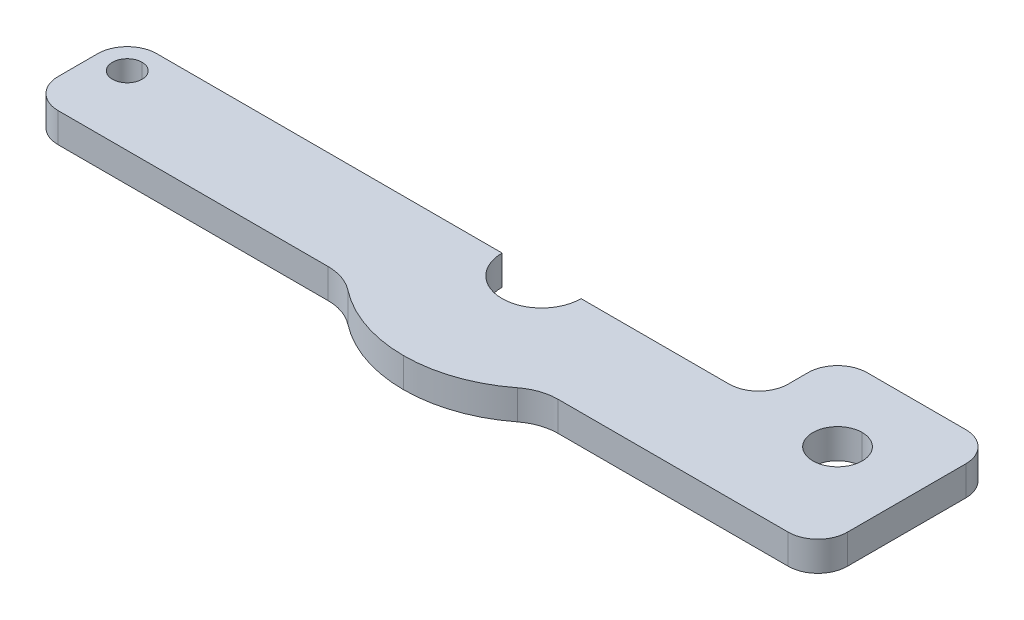
ISO-10303-21;
HEADER;
FILE_DESCRIPTION(('STEP AP214'),'2;1');
FILE_NAME('part.step','',(''),(''),'','','');
FILE_SCHEMA(('AUTOMOTIVE_DESIGN { 1 0 10303 214 1 1 1 1 }'));
ENDSEC;
DATA;
#1=APPLICATION_CONTEXT('core data for automotive mechanical design processes');
#2=APPLICATION_PROTOCOL_DEFINITION('international standard','automotive_design',2000,#1);
#3=PRODUCT_CONTEXT('',#1,'mechanical');
#4=PRODUCT('Part','Part','',(#3));
#5=PRODUCT_RELATED_PRODUCT_CATEGORY('part','',(#4));
#6=PRODUCT_DEFINITION_FORMATION('','',#4);
#7=PRODUCT_DEFINITION_CONTEXT('part definition',#1,'design');
#8=PRODUCT_DEFINITION('design','',#6,#7);
#9=PRODUCT_DEFINITION_SHAPE('','',#8);
#10=(LENGTH_UNIT() NAMED_UNIT(*) SI_UNIT(.MILLI.,.METRE.));
#11=(NAMED_UNIT(*) PLANE_ANGLE_UNIT() SI_UNIT($,.RADIAN.));
#12=(NAMED_UNIT(*) SI_UNIT($,.STERADIAN.) SOLID_ANGLE_UNIT());
#13=UNCERTAINTY_MEASURE_WITH_UNIT(LENGTH_MEASURE(1.E-05),#10,'distance_accuracy_value','');
#14=(GEOMETRIC_REPRESENTATION_CONTEXT(3) GLOBAL_UNCERTAINTY_ASSIGNED_CONTEXT((#13)) GLOBAL_UNIT_ASSIGNED_CONTEXT((#10,
#11,#12)) REPRESENTATION_CONTEXT('',''));
#15=CARTESIAN_POINT('',(0.,0.,0.));
#16=DIRECTION('',(0.,0.,1.));
#17=DIRECTION('',(1.,0.,0.));
#18=AXIS2_PLACEMENT_3D('',#15,#16,#17);
#19=CARTESIAN_POINT('',(11.6619037896906,-20.,15.));
#20=DIRECTION('',(0.,1.,0.));
#21=DIRECTION('',(0.,0.,1.));
#22=AXIS2_PLACEMENT_3D('',#19,#20,#21);
#23=CYLINDRICAL_SURFACE('',#22,5.);
#24=CARTESIAN_POINT('',(11.6619037896906,0.,15.));
#25=DIRECTION('',(0.,1.,0.));
#26=DIRECTION('',(0.,0.,1.));
#27=AXIS2_PLACEMENT_3D('',#24,#25,#26);
#28=CIRCLE('',#27,5.);
#29=CARTESIAN_POINT('',(11.6619037896906,0.,10.));
#30=VERTEX_POINT('',#29);
#31=CARTESIAN_POINT('',(8.59298173977202,0.,11.0526315789474));
#32=VERTEX_POINT('',#31);
#33=EDGE_CURVE('E237',#30,#32,#28,.T.);
#34=ORIENTED_EDGE('',*,*,#33,.F.);
#35=DIRECTION('',(0.,-1.,0.));
#36=VECTOR('',#35,1.);
#37=CARTESIAN_POINT('',(11.6619037896906,3.,10.));
#38=LINE('',#37,#36);
#39=CARTESIAN_POINT('',(11.6619037896906,3.,10.));
#40=VERTEX_POINT('',#39);
#41=EDGE_CURVE('E51',#40,#30,#38,.T.);
#42=ORIENTED_EDGE('',*,*,#41,.F.);
#43=CARTESIAN_POINT('',(11.6619037896906,3.,15.));
#44=DIRECTION('',(0.,-1.,0.));
#45=DIRECTION('',(0.,0.,1.));
#46=AXIS2_PLACEMENT_3D('',#43,#44,#45);
#47=CIRCLE('',#46,5.);
#48=CARTESIAN_POINT('',(8.59298173977202,3.,11.0526315789474));
#49=VERTEX_POINT('',#48);
#50=EDGE_CURVE('E458',#49,#40,#47,.T.);
#51=ORIENTED_EDGE('',*,*,#50,.F.);
#52=DIRECTION('',(0.,1.,0.));
#53=VECTOR('',#52,1.);
#54=CARTESIAN_POINT('',(8.59298173977202,-20.,11.0526315789474));
#55=LINE('',#54,#53);
#56=EDGE_CURVE('E11',#32,#49,#55,.T.);
#57=ORIENTED_EDGE('',*,*,#56,.F.);
#58=EDGE_LOOP('',(#34,#42,#51,#57));
#59=FACE_BOUND('',#58,.T.);
#60=ADVANCED_FACE('F17',(#59),#23,.F.);
#61=CARTESIAN_POINT('',(-11.6619037896906,-20.,15.));
#62=DIRECTION('',(0.,1.,0.));
#63=DIRECTION('',(0.,0.,1.));
#64=AXIS2_PLACEMENT_3D('',#61,#62,#63);
#65=CYLINDRICAL_SURFACE('',#64,5.);
#66=CARTESIAN_POINT('',(-11.6619037896906,0.,15.));
#67=DIRECTION('',(0.,1.,0.));
#68=DIRECTION('',(0.,0.,1.));
#69=AXIS2_PLACEMENT_3D('',#66,#67,#68);
#70=CIRCLE('',#69,5.);
#71=CARTESIAN_POINT('',(-8.59298173977202,0.,11.0526315789474));
#72=VERTEX_POINT('',#71);
#73=CARTESIAN_POINT('',(-11.6619037896906,0.,10.));
#74=VERTEX_POINT('',#73);
#75=EDGE_CURVE('E246',#72,#74,#70,.T.);
#76=ORIENTED_EDGE('',*,*,#75,.F.);
#77=DIRECTION('',(0.,-1.,0.));
#78=VECTOR('',#77,1.);
#79=CARTESIAN_POINT('',(-8.59298173977202,-20.,11.0526315789474));
#80=LINE('',#79,#78);
#81=CARTESIAN_POINT('',(-8.59298173977202,3.,11.0526315789474));
#82=VERTEX_POINT('',#81);
#83=EDGE_CURVE('E405',#82,#72,#80,.T.);
#84=ORIENTED_EDGE('',*,*,#83,.F.);
#85=CARTESIAN_POINT('',(-11.6619037896906,3.,15.));
#86=DIRECTION('',(0.,-1.,0.));
#87=DIRECTION('',(0.,0.,1.));
#88=AXIS2_PLACEMENT_3D('',#85,#86,#87);
#89=CIRCLE('',#88,5.);
#90=CARTESIAN_POINT('',(-11.6619037896906,3.,10.));
#91=VERTEX_POINT('',#90);
#92=EDGE_CURVE('E450',#91,#82,#89,.T.);
#93=ORIENTED_EDGE('',*,*,#92,.F.);
#94=DIRECTION('',(0.,1.,0.));
#95=VECTOR('',#94,1.);
#96=CARTESIAN_POINT('',(-11.6619037896906,3.,10.));
#97=LINE('',#96,#95);
#98=EDGE_CURVE('E414',#74,#91,#97,.T.);
#99=ORIENTED_EDGE('',*,*,#98,.F.);
#100=EDGE_LOOP('',(#76,#84,#93,#99));
#101=FACE_BOUND('',#100,.T.);
#102=ADVANCED_FACE('F573',(#101),#65,.F.);
#103=CARTESIAN_POINT('',(0.,-20.,0.));
#104=DIRECTION('',(0.,1.,0.));
#105=DIRECTION('',(0.,0.,1.));
#106=AXIS2_PLACEMENT_3D('',#103,#104,#105);
#107=CYLINDRICAL_SURFACE('',#106,14.);
#108=DIRECTION('',(0.,1.,0.));
#109=VECTOR('',#108,1.);
#110=CARTESIAN_POINT('',(0.,-20.,14.));
#111=LINE('',#110,#109);
#112=CARTESIAN_POINT('',(0.,0.,14.));
#113=VERTEX_POINT('',#112);
#114=CARTESIAN_POINT('',(0.,3.,14.));
#115=VERTEX_POINT('',#114);
#116=EDGE_CURVE('E390',#113,#115,#111,.T.);
#117=ORIENTED_EDGE('',*,*,#116,.F.);
#118=CARTESIAN_POINT('',(0.,0.,0.));
#119=DIRECTION('',(0.,-1.,0.));
#120=DIRECTION('',(0.,0.,1.));
#121=AXIS2_PLACEMENT_3D('',#118,#119,#120);
#122=CIRCLE('',#121,14.);
#123=EDGE_CURVE('E241',#32,#113,#122,.T.);
#124=ORIENTED_EDGE('',*,*,#123,.F.);
#125=ORIENTED_EDGE('',*,*,#56,.T.);
#126=CARTESIAN_POINT('',(0.,3.,0.));
#127=DIRECTION('',(0.,1.,0.));
#128=DIRECTION('',(0.,0.,1.));
#129=AXIS2_PLACEMENT_3D('',#126,#127,#128);
#130=CIRCLE('',#129,14.);
#131=EDGE_CURVE('E454',#115,#49,#130,.T.);
#132=ORIENTED_EDGE('',*,*,#131,.F.);
#133=EDGE_LOOP('',(#117,#124,#125,#132));
#134=FACE_BOUND('',#133,.T.);
#135=ADVANCED_FACE('F577',(#134),#107,.T.);
#136=CARTESIAN_POINT('',(-39.,-0.00100000000000013,3.));
#137=DIRECTION('',(0.,1.,0.));
#138=DIRECTION('',(0.,0.,1.));
#139=AXIS2_PLACEMENT_3D('',#136,#137,#138);
#140=CYLINDRICAL_SURFACE('',#139,1.5);
#141=DIRECTION('',(0.,1.,0.));
#142=VECTOR('',#141,1.);
#143=CARTESIAN_POINT('',(-39.,-0.00100000000000013,1.5));
#144=LINE('',#143,#142);
#145=CARTESIAN_POINT('',(-39.,0.,1.5));
#146=VERTEX_POINT('',#145);
#147=CARTESIAN_POINT('',(-39.,3.,1.5));
#148=VERTEX_POINT('',#147);
#149=EDGE_CURVE('E418',#146,#148,#144,.T.);
#150=ORIENTED_EDGE('',*,*,#149,.F.);
#151=CARTESIAN_POINT('',(-39.,0.,3.));
#152=DIRECTION('',(0.,-1.,0.));
#153=DIRECTION('',(0.,0.,1.));
#154=AXIS2_PLACEMENT_3D('',#151,#152,#153);
#155=CIRCLE('',#154,1.5);
#156=CARTESIAN_POINT('',(-39.,0.,4.5));
#157=VERTEX_POINT('',#156);
#158=EDGE_CURVE('E242',#146,#157,#155,.T.);
#159=ORIENTED_EDGE('',*,*,#158,.T.);
#160=DIRECTION('',(0.,1.,0.));
#161=VECTOR('',#160,1.);
#162=CARTESIAN_POINT('',(-39.,-0.00100000000000013,4.5));
#163=LINE('',#162,#161);
#164=CARTESIAN_POINT('',(-39.,3.,4.5));
#165=VERTEX_POINT('',#164);
#166=EDGE_CURVE('E423',#157,#165,#163,.T.);
#167=ORIENTED_EDGE('',*,*,#166,.T.);
#168=CARTESIAN_POINT('',(-39.,3.,3.));
#169=DIRECTION('',(0.,1.,0.));
#170=DIRECTION('',(0.,0.,1.));
#171=AXIS2_PLACEMENT_3D('',#168,#169,#170);
#172=CIRCLE('',#171,1.5);
#173=EDGE_CURVE('E325',#165,#148,#172,.T.);
#174=ORIENTED_EDGE('',*,*,#173,.T.);
#175=EDGE_LOOP('',(#150,#159,#167,#174));
#176=FACE_BOUND('',#175,.T.);
#177=ADVANCED_FACE('F555',(#176),#140,.F.);
#178=CARTESIAN_POINT('',(-39.,3.,3.));
#179=DIRECTION('',(0.,-1.,0.));
#180=DIRECTION('',(0.,0.,-1.));
#181=AXIS2_PLACEMENT_3D('',#178,#179,#180);
#182=CYLINDRICAL_SURFACE('',#181,3.);
#183=CARTESIAN_POINT('',(-39.,3.,3.));
#184=DIRECTION('',(0.,1.,0.));
#185=DIRECTION('',(0.,0.,1.));
#186=AXIS2_PLACEMENT_3D('',#183,#184,#185);
#187=CIRCLE('',#186,3.);
#188=CARTESIAN_POINT('',(-39.,3.,0.));
#189=VERTEX_POINT('',#188);
#190=CARTESIAN_POINT('',(-42.,3.,3.));
#191=VERTEX_POINT('',#190);
#192=EDGE_CURVE('E324',#189,#191,#187,.T.);
#193=ORIENTED_EDGE('',*,*,#192,.F.);
#194=DIRECTION('',(0.,1.,0.));
#195=VECTOR('',#194,1.);
#196=CARTESIAN_POINT('',(-39.,3.,0.));
#197=LINE('',#196,#195);
#198=CARTESIAN_POINT('',(-39.,0.,0.));
#199=VERTEX_POINT('',#198);
#200=EDGE_CURVE('E234',#199,#189,#197,.T.);
#201=ORIENTED_EDGE('',*,*,#200,.F.);
#202=CARTESIAN_POINT('',(-39.,0.,3.));
#203=DIRECTION('',(0.,-1.,0.));
#204=DIRECTION('',(0.,0.,1.));
#205=AXIS2_PLACEMENT_3D('',#202,#203,#204);
#206=CIRCLE('',#205,3.);
#207=CARTESIAN_POINT('',(-42.,0.,3.));
#208=VERTEX_POINT('',#207);
#209=EDGE_CURVE('E337',#208,#199,#206,.T.);
#210=ORIENTED_EDGE('',*,*,#209,.F.);
#211=DIRECTION('',(0.,-1.,0.));
#212=VECTOR('',#211,1.);
#213=CARTESIAN_POINT('',(-42.,3.,3.));
#214=LINE('',#213,#212);
#215=EDGE_CURVE('E233',#191,#208,#214,.T.);
#216=ORIENTED_EDGE('',*,*,#215,.F.);
#217=EDGE_LOOP('',(#193,#201,#210,#216));
#218=FACE_BOUND('',#217,.T.);
#219=ADVANCED_FACE('F378',(#218),#182,.T.);
#220=CARTESIAN_POINT('',(-39.,3.,7.));
#221=DIRECTION('',(0.,-1.,0.));
#222=DIRECTION('',(0.,0.,-1.));
#223=AXIS2_PLACEMENT_3D('',#220,#221,#222);
#224=CYLINDRICAL_SURFACE('',#223,3.);
#225=CARTESIAN_POINT('',(-39.,3.,7.));
#226=DIRECTION('',(0.,1.,0.));
#227=DIRECTION('',(0.,0.,1.));
#228=AXIS2_PLACEMENT_3D('',#225,#226,#227);
#229=CIRCLE('',#228,3.);
#230=CARTESIAN_POINT('',(-42.,3.,7.));
#231=VERTEX_POINT('',#230);
#232=CARTESIAN_POINT('',(-39.,3.,10.));
#233=VERTEX_POINT('',#232);
#234=EDGE_CURVE('E446',#231,#233,#229,.T.);
#235=ORIENTED_EDGE('',*,*,#234,.F.);
#236=DIRECTION('',(0.,1.,0.));
#237=VECTOR('',#236,1.);
#238=CARTESIAN_POINT('',(-42.,3.,7.));
#239=LINE('',#238,#237);
#240=CARTESIAN_POINT('',(-42.,0.,7.));
#241=VERTEX_POINT('',#240);
#242=EDGE_CURVE('E230',#241,#231,#239,.T.);
#243=ORIENTED_EDGE('',*,*,#242,.F.);
#244=CARTESIAN_POINT('',(-39.,0.,7.));
#245=DIRECTION('',(0.,-1.,0.));
#246=DIRECTION('',(0.,0.,1.));
#247=AXIS2_PLACEMENT_3D('',#244,#245,#246);
#248=CIRCLE('',#247,3.);
#249=CARTESIAN_POINT('',(-39.,0.,10.));
#250=VERTEX_POINT('',#249);
#251=EDGE_CURVE('E332',#250,#241,#248,.T.);
#252=ORIENTED_EDGE('',*,*,#251,.F.);
#253=DIRECTION('',(0.,-1.,0.));
#254=VECTOR('',#253,1.);
#255=CARTESIAN_POINT('',(-39.,3.,10.));
#256=LINE('',#255,#254);
#257=EDGE_CURVE('E440',#233,#250,#256,.T.);
#258=ORIENTED_EDGE('',*,*,#257,.F.);
#259=EDGE_LOOP('',(#235,#243,#252,#258));
#260=FACE_BOUND('',#259,.T.);
#261=ADVANCED_FACE('F980',(#260),#224,.T.);
#262=CARTESIAN_POINT('',(19.,3.,-3.));
#263=DIRECTION('',(0.,1.,0.));
#264=DIRECTION('',(0.,0.,1.));
#265=AXIS2_PLACEMENT_3D('',#262,#263,#264);
#266=CYLINDRICAL_SURFACE('',#265,3.);
#267=CARTESIAN_POINT('',(19.,3.,-3.));
#268=DIRECTION('',(0.,-1.,0.));
#269=DIRECTION('',(0.,0.,1.));
#270=AXIS2_PLACEMENT_3D('',#267,#268,#269);
#271=CIRCLE('',#270,3.);
#272=CARTESIAN_POINT('',(22.,3.,-3.));
#273=VERTEX_POINT('',#272);
#274=CARTESIAN_POINT('',(19.,3.,0.));
#275=VERTEX_POINT('',#274);
#276=EDGE_CURVE('E308',#273,#275,#271,.T.);
#277=ORIENTED_EDGE('',*,*,#276,.F.);
#278=DIRECTION('',(0.,1.,0.));
#279=VECTOR('',#278,1.);
#280=CARTESIAN_POINT('',(22.,3.,-3.));
#281=LINE('',#280,#279);
#282=CARTESIAN_POINT('',(22.,0.,-3.));
#283=VERTEX_POINT('',#282);
#284=EDGE_CURVE('E250',#283,#273,#281,.T.);
#285=ORIENTED_EDGE('',*,*,#284,.F.);
#286=CARTESIAN_POINT('',(19.,0.,-3.));
#287=DIRECTION('',(0.,1.,0.));
#288=DIRECTION('',(0.,0.,1.));
#289=AXIS2_PLACEMENT_3D('',#286,#287,#288);
#290=CIRCLE('',#289,3.);
#291=CARTESIAN_POINT('',(19.,0.,0.));
#292=VERTEX_POINT('',#291);
#293=EDGE_CURVE('E353',#292,#283,#290,.T.);
#294=ORIENTED_EDGE('',*,*,#293,.F.);
#295=DIRECTION('',(0.,-1.,0.));
#296=VECTOR('',#295,1.);
#297=CARTESIAN_POINT('',(19.,0.,0.));
#298=LINE('',#297,#296);
#299=EDGE_CURVE('E253',#275,#292,#298,.T.);
#300=ORIENTED_EDGE('',*,*,#299,.F.);
#301=EDGE_LOOP('',(#277,#285,#294,#300));
#302=FACE_BOUND('',#301,.T.);
#303=ADVANCED_FACE('F488',(#302),#266,.F.);
#304=CARTESIAN_POINT('',(25.,3.,-5.));
#305=DIRECTION('',(0.,-1.,0.));
#306=DIRECTION('',(0.,0.,-1.));
#307=AXIS2_PLACEMENT_3D('',#304,#305,#306);
#308=CYLINDRICAL_SURFACE('',#307,3.);
#309=CARTESIAN_POINT('',(25.,3.,-5.));
#310=DIRECTION('',(0.,1.,0.));
#311=DIRECTION('',(0.,0.,1.));
#312=AXIS2_PLACEMENT_3D('',#309,#310,#311);
#313=CIRCLE('',#312,3.);
#314=CARTESIAN_POINT('',(25.,3.,-8.));
#315=VERTEX_POINT('',#314);
#316=CARTESIAN_POINT('',(22.,3.,-5.));
#317=VERTEX_POINT('',#316);
#318=EDGE_CURVE('E283',#315,#317,#313,.T.);
#319=ORIENTED_EDGE('',*,*,#318,.F.);
#320=DIRECTION('',(0.,1.,0.));
#321=VECTOR('',#320,1.);
#322=CARTESIAN_POINT('',(25.,3.,-8.));
#323=LINE('',#322,#321);
#324=CARTESIAN_POINT('',(25.,0.,-8.));
#325=VERTEX_POINT('',#324);
#326=EDGE_CURVE('E20',#325,#315,#323,.T.);
#327=ORIENTED_EDGE('',*,*,#326,.F.);
#328=CARTESIAN_POINT('',(25.,0.,-5.));
#329=DIRECTION('',(0.,-1.,0.));
#330=DIRECTION('',(0.,0.,1.));
#331=AXIS2_PLACEMENT_3D('',#328,#329,#330);
#332=CIRCLE('',#331,3.);
#333=CARTESIAN_POINT('',(22.,0.,-5.));
#334=VERTEX_POINT('',#333);
#335=EDGE_CURVE('E362',#334,#325,#332,.T.);
#336=ORIENTED_EDGE('',*,*,#335,.F.);
#337=DIRECTION('',(0.,-1.,0.));
#338=VECTOR('',#337,1.);
#339=CARTESIAN_POINT('',(22.,3.,-5.));
#340=LINE('',#339,#338);
#341=EDGE_CURVE('E247',#317,#334,#340,.T.);
#342=ORIENTED_EDGE('',*,*,#341,.F.);
#343=EDGE_LOOP('',(#319,#327,#336,#342));
#344=FACE_BOUND('',#343,.T.);
#345=ADVANCED_FACE('F284',(#344),#308,.T.);
#346=CARTESIAN_POINT('',(35.,3.,-5.));
#347=DIRECTION('',(0.,-1.,0.));
#348=DIRECTION('',(0.,0.,-1.));
#349=AXIS2_PLACEMENT_3D('',#346,#347,#348);
#350=CYLINDRICAL_SURFACE('',#349,3.);
#351=CARTESIAN_POINT('',(35.,3.,-5.));
#352=DIRECTION('',(0.,1.,0.));
#353=DIRECTION('',(0.,0.,1.));
#354=AXIS2_PLACEMENT_3D('',#351,#352,#353);
#355=CIRCLE('',#354,3.);
#356=CARTESIAN_POINT('',(38.,3.,-5.));
#357=VERTEX_POINT('',#356);
#358=CARTESIAN_POINT('',(35.,3.,-8.));
#359=VERTEX_POINT('',#358);
#360=EDGE_CURVE('E294',#357,#359,#355,.T.);
#361=ORIENTED_EDGE('',*,*,#360,.F.);
#362=DIRECTION('',(0.,1.,0.));
#363=VECTOR('',#362,1.);
#364=CARTESIAN_POINT('',(38.,3.,-5.));
#365=LINE('',#364,#363);
#366=CARTESIAN_POINT('',(38.,0.,-5.));
#367=VERTEX_POINT('',#366);
#368=EDGE_CURVE('E202',#367,#357,#365,.T.);
#369=ORIENTED_EDGE('',*,*,#368,.F.);
#370=CARTESIAN_POINT('',(35.,0.,-5.));
#371=DIRECTION('',(0.,-1.,0.));
#372=DIRECTION('',(0.,0.,1.));
#373=AXIS2_PLACEMENT_3D('',#370,#371,#372);
#374=CIRCLE('',#373,3.);
#375=CARTESIAN_POINT('',(35.,0.,-8.));
#376=VERTEX_POINT('',#375);
#377=EDGE_CURVE('E217',#376,#367,#374,.T.);
#378=ORIENTED_EDGE('',*,*,#377,.F.);
#379=DIRECTION('',(0.,-1.,0.));
#380=VECTOR('',#379,1.);
#381=CARTESIAN_POINT('',(35.,3.,-8.));
#382=LINE('',#381,#380);
#383=EDGE_CURVE('E263',#359,#376,#382,.T.);
#384=ORIENTED_EDGE('',*,*,#383,.F.);
#385=EDGE_LOOP('',(#361,#369,#378,#384));
#386=FACE_BOUND('',#385,.T.);
#387=ADVANCED_FACE('F951',(#386),#350,.T.);
#388=CARTESIAN_POINT('',(35.,3.,7.));
#389=DIRECTION('',(0.,-1.,0.));
#390=DIRECTION('',(0.,0.,-1.));
#391=AXIS2_PLACEMENT_3D('',#388,#389,#390);
#392=CYLINDRICAL_SURFACE('',#391,3.);
#393=CARTESIAN_POINT('',(35.,3.,7.));
#394=DIRECTION('',(0.,1.,0.));
#395=DIRECTION('',(0.,0.,1.));
#396=AXIS2_PLACEMENT_3D('',#393,#394,#395);
#397=CIRCLE('',#396,3.);
#398=CARTESIAN_POINT('',(35.,3.,10.));
#399=VERTEX_POINT('',#398);
#400=CARTESIAN_POINT('',(38.,3.,7.));
#401=VERTEX_POINT('',#400);
#402=EDGE_CURVE('E466',#399,#401,#397,.T.);
#403=ORIENTED_EDGE('',*,*,#402,.F.);
#404=DIRECTION('',(0.,1.,0.));
#405=VECTOR('',#404,1.);
#406=CARTESIAN_POINT('',(35.,3.,10.));
#407=LINE('',#406,#405);
#408=CARTESIAN_POINT('',(35.,0.,10.));
#409=VERTEX_POINT('',#408);
#410=EDGE_CURVE('E203',#409,#399,#407,.T.);
#411=ORIENTED_EDGE('',*,*,#410,.F.);
#412=CARTESIAN_POINT('',(35.,0.,7.));
#413=DIRECTION('',(0.,-1.,0.));
#414=DIRECTION('',(0.,0.,1.));
#415=AXIS2_PLACEMENT_3D('',#412,#413,#414);
#416=CIRCLE('',#415,3.);
#417=CARTESIAN_POINT('',(38.,0.,7.));
#418=VERTEX_POINT('',#417);
#419=EDGE_CURVE('E206',#418,#409,#416,.T.);
#420=ORIENTED_EDGE('',*,*,#419,.F.);
#421=DIRECTION('',(0.,-1.,0.));
#422=VECTOR('',#421,1.);
#423=CARTESIAN_POINT('',(38.,3.,7.));
#424=LINE('',#423,#422);
#425=EDGE_CURVE('E190',#401,#418,#424,.T.);
#426=ORIENTED_EDGE('',*,*,#425,.F.);
#427=EDGE_LOOP('',(#403,#411,#420,#426));
#428=FACE_BOUND('',#427,.T.);
#429=ADVANCED_FACE('F207',(#428),#392,.T.);
#430=CARTESIAN_POINT('',(30.,3.,0.));
#431=DIRECTION('',(0.,-1.,0.));
#432=DIRECTION('',(0.,0.,-1.));
#433=AXIS2_PLACEMENT_3D('',#430,#431,#432);
#434=CYLINDRICAL_SURFACE('',#433,2.5);
#435=DIRECTION('',(0.,-1.,0.));
#436=VECTOR('',#435,1.);
#437=CARTESIAN_POINT('',(30.,3.,2.5));
#438=LINE('',#437,#436);
#439=CARTESIAN_POINT('',(30.,3.,2.5));
#440=VERTEX_POINT('',#439);
#441=CARTESIAN_POINT('',(30.,0.,2.5));
#442=VERTEX_POINT('',#441);
#443=EDGE_CURVE('E401',#440,#442,#438,.T.);
#444=ORIENTED_EDGE('',*,*,#443,.F.);
#445=CARTESIAN_POINT('',(30.,3.,0.));
#446=DIRECTION('',(0.,1.,0.));
#447=DIRECTION('',(0.,0.,1.));
#448=AXIS2_PLACEMENT_3D('',#445,#446,#447);
#449=CIRCLE('',#448,2.5);
#450=CARTESIAN_POINT('',(30.,3.,-2.5));
#451=VERTEX_POINT('',#450);
#452=EDGE_CURVE('E329',#440,#451,#449,.T.);
#453=ORIENTED_EDGE('',*,*,#452,.T.);
#454=DIRECTION('',(0.,-1.,0.));
#455=VECTOR('',#454,1.);
#456=CARTESIAN_POINT('',(30.,3.,-2.5));
#457=LINE('',#456,#455);
#458=CARTESIAN_POINT('',(30.,0.,-2.5));
#459=VERTEX_POINT('',#458);
#460=EDGE_CURVE('E400',#451,#459,#457,.T.);
#461=ORIENTED_EDGE('',*,*,#460,.T.);
#462=CARTESIAN_POINT('',(30.,0.,0.));
#463=DIRECTION('',(0.,1.,0.));
#464=DIRECTION('',(0.,0.,1.));
#465=AXIS2_PLACEMENT_3D('',#462,#463,#464);
#466=CIRCLE('',#465,2.5);
#467=EDGE_CURVE('E228',#442,#459,#466,.T.);
#468=ORIENTED_EDGE('',*,*,#467,.F.);
#469=EDGE_LOOP('',(#444,#453,#461,#468));
#470=FACE_BOUND('',#469,.T.);
#471=ADVANCED_FACE('F844',(#470),#434,.F.);
#472=CARTESIAN_POINT('',(38.,3.,-8.));
#473=DIRECTION('',(0.,0.,1.));
#474=DIRECTION('',(1.,0.,0.));
#475=AXIS2_PLACEMENT_3D('',#472,#473,#474);
#476=PLANE('',#475);
#477=DIRECTION('',(-1.,0.,0.));
#478=VECTOR('',#477,1.);
#479=CARTESIAN_POINT('',(38.,3.,-8.));
#480=LINE('',#479,#478);
#481=EDGE_CURVE('E277',#359,#315,#480,.T.);
#482=ORIENTED_EDGE('',*,*,#481,.F.);
#483=ORIENTED_EDGE('',*,*,#383,.T.);
#484=DIRECTION('',(-1.,0.,0.));
#485=VECTOR('',#484,1.);
#486=CARTESIAN_POINT('',(38.,0.,-8.));
#487=LINE('',#486,#485);
#488=EDGE_CURVE('E224',#376,#325,#487,.T.);
#489=ORIENTED_EDGE('',*,*,#488,.T.);
#490=ORIENTED_EDGE('',*,*,#326,.T.);
#491=EDGE_LOOP('',(#482,#483,#489,#490));
#492=FACE_BOUND('',#491,.T.);
#493=ADVANCED_FACE('F275',(#492),#476,.F.);
#494=CARTESIAN_POINT('',(38.,3.,10.));
#495=DIRECTION('',(-1.,0.,0.));
#496=DIRECTION('',(0.,0.,1.));
#497=AXIS2_PLACEMENT_3D('',#494,#495,#496);
#498=PLANE('',#497);
#499=DIRECTION('',(0.,0.,-1.));
#500=VECTOR('',#499,1.);
#501=CARTESIAN_POINT('',(38.,3.,10.));
#502=LINE('',#501,#500);
#503=EDGE_CURVE('E197',#401,#357,#502,.T.);
#504=ORIENTED_EDGE('',*,*,#503,.F.);
#505=ORIENTED_EDGE('',*,*,#425,.T.);
#506=DIRECTION('',(0.,0.,-1.));
#507=VECTOR('',#506,1.);
#508=CARTESIAN_POINT('',(38.,0.,10.));
#509=LINE('',#508,#507);
#510=EDGE_CURVE('E194',#418,#367,#509,.T.);
#511=ORIENTED_EDGE('',*,*,#510,.T.);
#512=ORIENTED_EDGE('',*,*,#368,.T.);
#513=EDGE_LOOP('',(#504,#505,#511,#512));
#514=FACE_BOUND('',#513,.T.);
#515=ADVANCED_FACE('F192',(#514),#498,.F.);
#516=CARTESIAN_POINT('',(-42.,3.,10.));
#517=DIRECTION('',(0.,0.,-1.));
#518=DIRECTION('',(0.,-1.,0.));
#519=AXIS2_PLACEMENT_3D('',#516,#517,#518);
#520=PLANE('',#519);
#521=DIRECTION('',(1.,0.,0.));
#522=VECTOR('',#521,1.);
#523=CARTESIAN_POINT('',(-42.,3.,10.));
#524=LINE('',#523,#522);
#525=EDGE_CURVE('E462',#40,#399,#524,.T.);
#526=ORIENTED_EDGE('',*,*,#525,.F.);
#527=ORIENTED_EDGE('',*,*,#41,.T.);
#528=DIRECTION('',(1.,0.,0.));
#529=VECTOR('',#528,1.);
#530=CARTESIAN_POINT('',(-42.,0.,10.));
#531=LINE('',#530,#529);
#532=EDGE_CURVE('E211',#30,#409,#531,.T.);
#533=ORIENTED_EDGE('',*,*,#532,.T.);
#534=ORIENTED_EDGE('',*,*,#410,.T.);
#535=EDGE_LOOP('',(#526,#527,#533,#534));
#536=FACE_BOUND('',#535,.T.);
#537=ADVANCED_FACE('F579',(#536),#520,.F.);
#538=CARTESIAN_POINT('',(-42.,3.,0.));
#539=DIRECTION('',(1.,0.,0.));
#540=DIRECTION('',(0.,1.,0.));
#541=AXIS2_PLACEMENT_3D('',#538,#539,#540);
#542=PLANE('',#541);
#543=DIRECTION('',(0.,0.,1.));
#544=VECTOR('',#543,1.);
#545=CARTESIAN_POINT('',(-42.,0.,0.));
#546=LINE('',#545,#544);
#547=EDGE_CURVE('E336',#208,#241,#546,.T.);
#548=ORIENTED_EDGE('',*,*,#547,.T.);
#549=ORIENTED_EDGE('',*,*,#242,.T.);
#550=DIRECTION('',(0.,0.,1.));
#551=VECTOR('',#550,1.);
#552=CARTESIAN_POINT('',(-42.,3.,0.));
#553=LINE('',#552,#551);
#554=EDGE_CURVE('E374',#191,#231,#553,.T.);
#555=ORIENTED_EDGE('',*,*,#554,.F.);
#556=ORIENTED_EDGE('',*,*,#215,.T.);
#557=EDGE_LOOP('',(#548,#549,#555,#556));
#558=FACE_BOUND('',#557,.T.);
#559=ADVANCED_FACE('F372',(#558),#542,.F.);
#560=CARTESIAN_POINT('',(-4.,3.,0.));
#561=DIRECTION('',(0.,0.,1.));
#562=DIRECTION('',(1.,0.,0.));
#563=AXIS2_PLACEMENT_3D('',#560,#561,#562);
#564=PLANE('',#563);
#565=DIRECTION('',(-1.,0.,0.));
#566=VECTOR('',#565,1.);
#567=CARTESIAN_POINT('',(-4.,0.,0.));
#568=LINE('',#567,#566);
#569=CARTESIAN_POINT('',(-4.,0.,0.));
#570=VERTEX_POINT('',#569);
#571=EDGE_CURVE('E341',#570,#199,#568,.T.);
#572=ORIENTED_EDGE('',*,*,#571,.T.);
#573=ORIENTED_EDGE('',*,*,#200,.T.);
#574=DIRECTION('',(-1.,0.,0.));
#575=VECTOR('',#574,1.);
#576=CARTESIAN_POINT('',(-4.,3.,0.));
#577=LINE('',#576,#575);
#578=CARTESIAN_POINT('',(-4.,3.,0.));
#579=VERTEX_POINT('',#578);
#580=EDGE_CURVE('E320',#579,#189,#577,.T.);
#581=ORIENTED_EDGE('',*,*,#580,.F.);
#582=DIRECTION('',(0.,-1.,0.));
#583=VECTOR('',#582,1.);
#584=CARTESIAN_POINT('',(-4.,3.,0.));
#585=LINE('',#584,#583);
#586=EDGE_CURVE('E259',#579,#570,#585,.T.);
#587=ORIENTED_EDGE('',*,*,#586,.T.);
#588=EDGE_LOOP('',(#572,#573,#581,#587));
#589=FACE_BOUND('',#588,.T.);
#590=ADVANCED_FACE('F475',(#589),#564,.F.);
#591=CARTESIAN_POINT('',(0.,3.,0.));
#592=DIRECTION('',(0.,-1.,0.));
#593=DIRECTION('',(0.,0.,-1.));
#594=AXIS2_PLACEMENT_3D('',#591,#592,#593);
#595=CYLINDRICAL_SURFACE('',#594,4.);
#596=CARTESIAN_POINT('',(0.,0.,0.));
#597=DIRECTION('',(0.,-1.,0.));
#598=DIRECTION('',(0.,0.,1.));
#599=AXIS2_PLACEMENT_3D('',#596,#597,#598);
#600=CIRCLE('',#599,4.);
#601=CARTESIAN_POINT('',(4.,0.,0.));
#602=VERTEX_POINT('',#601);
#603=EDGE_CURVE('E345',#602,#570,#600,.T.);
#604=ORIENTED_EDGE('',*,*,#603,.T.);
#605=ORIENTED_EDGE('',*,*,#586,.F.);
#606=CARTESIAN_POINT('',(0.,3.,0.));
#607=DIRECTION('',(0.,-1.,0.));
#608=DIRECTION('',(0.,0.,1.));
#609=AXIS2_PLACEMENT_3D('',#606,#607,#608);
#610=CIRCLE('',#609,4.);
#611=CARTESIAN_POINT('',(4.,3.,0.));
#612=VERTEX_POINT('',#611);
#613=EDGE_CURVE('E316',#612,#579,#610,.T.);
#614=ORIENTED_EDGE('',*,*,#613,.F.);
#615=DIRECTION('',(0.,-1.,0.));
#616=VECTOR('',#615,1.);
#617=CARTESIAN_POINT('',(4.,3.,0.));
#618=LINE('',#617,#616);
#619=EDGE_CURVE('E256',#612,#602,#618,.T.);
#620=ORIENTED_EDGE('',*,*,#619,.T.);
#621=EDGE_LOOP('',(#604,#605,#614,#620));
#622=FACE_BOUND('',#621,.T.);
#623=ADVANCED_FACE('F479',(#622),#595,.F.);
#624=CARTESIAN_POINT('',(22.,3.,0.));
#625=DIRECTION('',(0.,0.,1.));
#626=DIRECTION('',(1.,0.,0.));
#627=AXIS2_PLACEMENT_3D('',#624,#625,#626);
#628=PLANE('',#627);
#629=DIRECTION('',(-1.,0.,0.));
#630=VECTOR('',#629,1.);
#631=CARTESIAN_POINT('',(22.,3.,0.));
#632=LINE('',#631,#630);
#633=EDGE_CURVE('E312',#275,#612,#632,.T.);
#634=ORIENTED_EDGE('',*,*,#633,.F.);
#635=ORIENTED_EDGE('',*,*,#299,.T.);
#636=DIRECTION('',(-1.,0.,0.));
#637=VECTOR('',#636,1.);
#638=CARTESIAN_POINT('',(22.,0.,0.));
#639=LINE('',#638,#637);
#640=EDGE_CURVE('E349',#292,#602,#639,.T.);
#641=ORIENTED_EDGE('',*,*,#640,.T.);
#642=ORIENTED_EDGE('',*,*,#619,.F.);
#643=EDGE_LOOP('',(#634,#635,#641,#642));
#644=FACE_BOUND('',#643,.T.);
#645=ADVANCED_FACE('F485',(#644),#628,.F.);
#646=CARTESIAN_POINT('',(22.,3.,-8.));
#647=DIRECTION('',(1.,0.,0.));
#648=DIRECTION('',(0.,1.,0.));
#649=AXIS2_PLACEMENT_3D('',#646,#647,#648);
#650=PLANE('',#649);
#651=DIRECTION('',(0.,0.,1.));
#652=VECTOR('',#651,1.);
#653=CARTESIAN_POINT('',(22.,3.,-8.));
#654=LINE('',#653,#652);
#655=EDGE_CURVE('E289',#317,#273,#654,.T.);
#656=ORIENTED_EDGE('',*,*,#655,.F.);
#657=ORIENTED_EDGE('',*,*,#341,.T.);
#658=DIRECTION('',(0.,0.,1.));
#659=VECTOR('',#658,1.);
#660=CARTESIAN_POINT('',(22.,0.,-8.));
#661=LINE('',#660,#659);
#662=EDGE_CURVE('E357',#334,#283,#661,.T.);
#663=ORIENTED_EDGE('',*,*,#662,.T.);
#664=ORIENTED_EDGE('',*,*,#284,.T.);
#665=EDGE_LOOP('',(#656,#657,#663,#664));
#666=FACE_BOUND('',#665,.T.);
#667=ADVANCED_FACE('F490',(#666),#650,.F.);
#668=CARTESIAN_POINT('',(0.,0.,0.));
#669=DIRECTION('',(0.,1.,0.));
#670=DIRECTION('',(1.,0.,0.));
#671=AXIS2_PLACEMENT_3D('',#668,#669,#670);
#672=PLANE('',#671);
#673=CARTESIAN_POINT('',(30.,0.,0.));
#674=DIRECTION('',(0.,1.,0.));
#675=DIRECTION('',(0.,0.,1.));
#676=AXIS2_PLACEMENT_3D('',#673,#674,#675);
#677=CIRCLE('',#676,2.5);
#678=EDGE_CURVE('E396',#459,#442,#677,.T.);
#679=ORIENTED_EDGE('',*,*,#678,.T.);
#680=ORIENTED_EDGE('',*,*,#467,.T.);
#681=EDGE_LOOP('',(#679,#680));
#682=FACE_BOUND('',#681,.T.);
#683=CARTESIAN_POINT('',(-39.,0.,3.));
#684=DIRECTION('',(0.,-1.,0.));
#685=DIRECTION('',(0.,0.,1.));
#686=AXIS2_PLACEMENT_3D('',#683,#684,#685);
#687=CIRCLE('',#686,1.5);
#688=EDGE_CURVE('E409',#157,#146,#687,.T.);
#689=ORIENTED_EDGE('',*,*,#688,.F.);
#690=ORIENTED_EDGE('',*,*,#158,.F.);
#691=EDGE_LOOP('',(#689,#690));
#692=FACE_BOUND('',#691,.T.);
#693=DIRECTION('',(1.,0.,0.));
#694=VECTOR('',#693,1.);
#695=CARTESIAN_POINT('',(-42.,0.,10.));
#696=LINE('',#695,#694);
#697=EDGE_CURVE('E410',#250,#74,#696,.T.);
#698=ORIENTED_EDGE('',*,*,#697,.F.);
#699=ORIENTED_EDGE('',*,*,#251,.T.);
#700=ORIENTED_EDGE('',*,*,#547,.F.);
#701=ORIENTED_EDGE('',*,*,#209,.T.);
#702=ORIENTED_EDGE('',*,*,#571,.F.);
#703=ORIENTED_EDGE('',*,*,#603,.F.);
#704=ORIENTED_EDGE('',*,*,#640,.F.);
#705=ORIENTED_EDGE('',*,*,#293,.T.);
#706=ORIENTED_EDGE('',*,*,#662,.F.);
#707=ORIENTED_EDGE('',*,*,#335,.T.);
#708=ORIENTED_EDGE('',*,*,#488,.F.);
#709=ORIENTED_EDGE('',*,*,#377,.T.);
#710=ORIENTED_EDGE('',*,*,#510,.F.);
#711=ORIENTED_EDGE('',*,*,#419,.T.);
#712=ORIENTED_EDGE('',*,*,#532,.F.);
#713=ORIENTED_EDGE('',*,*,#33,.T.);
#714=ORIENTED_EDGE('',*,*,#123,.T.);
#715=CARTESIAN_POINT('',(0.,0.,0.));
#716=DIRECTION('',(0.,-1.,0.));
#717=DIRECTION('',(0.,0.,1.));
#718=AXIS2_PLACEMENT_3D('',#715,#716,#717);
#719=CIRCLE('',#718,14.);
#720=EDGE_CURVE('E395',#113,#72,#719,.T.);
#721=ORIENTED_EDGE('',*,*,#720,.T.);
#722=ORIENTED_EDGE('',*,*,#75,.T.);
#723=EDGE_LOOP('',(#698,#699,#700,#701,#702,#703,#704,#705,#706,#707,#708,#709,#710,#711,#712,
#713,#714,#721,#722));
#724=FACE_BOUND('',#723,.T.);
#725=ADVANCED_FACE('F214',(#682,#692,#724),#672,.F.);
#726=CARTESIAN_POINT('',(0.,3.,0.));
#727=DIRECTION('',(0.,1.,0.));
#728=DIRECTION('',(1.,0.,0.));
#729=AXIS2_PLACEMENT_3D('',#726,#727,#728);
#730=PLANE('',#729);
#731=CARTESIAN_POINT('',(30.,3.,0.));
#732=DIRECTION('',(0.,1.,0.));
#733=DIRECTION('',(0.,0.,1.));
#734=AXIS2_PLACEMENT_3D('',#731,#732,#733);
#735=CIRCLE('',#734,2.5);
#736=EDGE_CURVE('E386',#451,#440,#735,.T.);
#737=ORIENTED_EDGE('',*,*,#736,.F.);
#738=ORIENTED_EDGE('',*,*,#452,.F.);
#739=EDGE_LOOP('',(#737,#738));
#740=FACE_BOUND('',#739,.T.);
#741=ORIENTED_EDGE('',*,*,#173,.F.);
#742=CARTESIAN_POINT('',(-39.,3.,3.));
#743=DIRECTION('',(0.,1.,0.));
#744=DIRECTION('',(0.,0.,1.));
#745=AXIS2_PLACEMENT_3D('',#742,#743,#744);
#746=CIRCLE('',#745,1.5);
#747=EDGE_CURVE('E419',#148,#165,#746,.T.);
#748=ORIENTED_EDGE('',*,*,#747,.F.);
#749=EDGE_LOOP('',(#741,#748));
#750=FACE_BOUND('',#749,.T.);
#751=ORIENTED_EDGE('',*,*,#554,.T.);
#752=ORIENTED_EDGE('',*,*,#234,.T.);
#753=DIRECTION('',(1.,0.,0.));
#754=VECTOR('',#753,1.);
#755=CARTESIAN_POINT('',(-42.,3.,10.));
#756=LINE('',#755,#754);
#757=EDGE_CURVE('E438',#233,#91,#756,.T.);
#758=ORIENTED_EDGE('',*,*,#757,.T.);
#759=ORIENTED_EDGE('',*,*,#92,.T.);
#760=CARTESIAN_POINT('',(0.,3.,0.));
#761=DIRECTION('',(0.,1.,0.));
#762=DIRECTION('',(0.,0.,1.));
#763=AXIS2_PLACEMENT_3D('',#760,#761,#762);
#764=CIRCLE('',#763,14.);
#765=EDGE_CURVE('E394',#82,#115,#764,.T.);
#766=ORIENTED_EDGE('',*,*,#765,.T.);
#767=ORIENTED_EDGE('',*,*,#131,.T.);
#768=ORIENTED_EDGE('',*,*,#50,.T.);
#769=ORIENTED_EDGE('',*,*,#525,.T.);
#770=ORIENTED_EDGE('',*,*,#402,.T.);
#771=ORIENTED_EDGE('',*,*,#503,.T.);
#772=ORIENTED_EDGE('',*,*,#360,.T.);
#773=ORIENTED_EDGE('',*,*,#481,.T.);
#774=ORIENTED_EDGE('',*,*,#318,.T.);
#775=ORIENTED_EDGE('',*,*,#655,.T.);
#776=ORIENTED_EDGE('',*,*,#276,.T.);
#777=ORIENTED_EDGE('',*,*,#633,.T.);
#778=ORIENTED_EDGE('',*,*,#613,.T.);
#779=ORIENTED_EDGE('',*,*,#580,.T.);
#780=ORIENTED_EDGE('',*,*,#192,.T.);
#781=EDGE_LOOP('',(#751,#752,#758,#759,#766,#767,#768,#769,#770,#771,#772,#773,#774,#775,#776,
#777,#778,#779,#780));
#782=FACE_BOUND('',#781,.T.);
#783=ADVANCED_FACE('F292',(#740,#750,#782),#730,.T.);
#784=CARTESIAN_POINT('',(-42.,3.,10.));
#785=DIRECTION('',(0.,0.,-1.));
#786=DIRECTION('',(0.,-1.,0.));
#787=AXIS2_PLACEMENT_3D('',#784,#785,#786);
#788=PLANE('',#787);
#789=ORIENTED_EDGE('',*,*,#697,.T.);
#790=ORIENTED_EDGE('',*,*,#98,.T.);
#791=ORIENTED_EDGE('',*,*,#757,.F.);
#792=ORIENTED_EDGE('',*,*,#257,.T.);
#793=EDGE_LOOP('',(#789,#790,#791,#792));
#794=FACE_BOUND('',#793,.T.);
#795=ADVANCED_FACE('F566',(#794),#788,.F.);
#796=CARTESIAN_POINT('',(30.,3.,0.));
#797=DIRECTION('',(0.,-1.,0.));
#798=DIRECTION('',(0.,0.,-1.));
#799=AXIS2_PLACEMENT_3D('',#796,#797,#798);
#800=CYLINDRICAL_SURFACE('',#799,2.5);
#801=ORIENTED_EDGE('',*,*,#736,.T.);
#802=ORIENTED_EDGE('',*,*,#443,.T.);
#803=ORIENTED_EDGE('',*,*,#678,.F.);
#804=ORIENTED_EDGE('',*,*,#460,.F.);
#805=EDGE_LOOP('',(#801,#802,#803,#804));
#806=FACE_BOUND('',#805,.T.);
#807=ADVANCED_FACE('F829',(#806),#800,.F.);
#808=CARTESIAN_POINT('',(-39.,-0.00100000000000013,3.));
#809=DIRECTION('',(0.,1.,0.));
#810=DIRECTION('',(0.,0.,1.));
#811=AXIS2_PLACEMENT_3D('',#808,#809,#810);
#812=CYLINDRICAL_SURFACE('',#811,1.5);
#813=ORIENTED_EDGE('',*,*,#688,.T.);
#814=ORIENTED_EDGE('',*,*,#149,.T.);
#815=ORIENTED_EDGE('',*,*,#747,.T.);
#816=ORIENTED_EDGE('',*,*,#166,.F.);
#817=EDGE_LOOP('',(#813,#814,#815,#816));
#818=FACE_BOUND('',#817,.T.);
#819=ADVANCED_FACE('F557',(#818),#812,.F.);
#820=CARTESIAN_POINT('',(0.,-20.,0.));
#821=DIRECTION('',(0.,1.,0.));
#822=DIRECTION('',(0.,0.,1.));
#823=AXIS2_PLACEMENT_3D('',#820,#821,#822);
#824=CYLINDRICAL_SURFACE('',#823,14.);
#825=ORIENTED_EDGE('',*,*,#720,.F.);
#826=ORIENTED_EDGE('',*,*,#116,.T.);
#827=ORIENTED_EDGE('',*,*,#765,.F.);
#828=ORIENTED_EDGE('',*,*,#83,.T.);
#829=EDGE_LOOP('',(#825,#826,#827,#828));
#830=FACE_BOUND('',#829,.T.);
#831=ADVANCED_FACE('F512',(#830),#824,.T.);
#832=CLOSED_SHELL('',(#60,#102,#135,#177,#219,#261,#303,#345,#387,#429,#471,#493,#515,#537,#559,
#590,#623,#645,#667,#725,#783,#795,#807,#819,#831));
#833=MANIFOLD_SOLID_BREP('B1',#832);
#834=ADVANCED_BREP_SHAPE_REPRESENTATION('',(#18,#833),#14);
#835=SHAPE_DEFINITION_REPRESENTATION(#9,#834);
ENDSEC;
END-ISO-10303-21;
